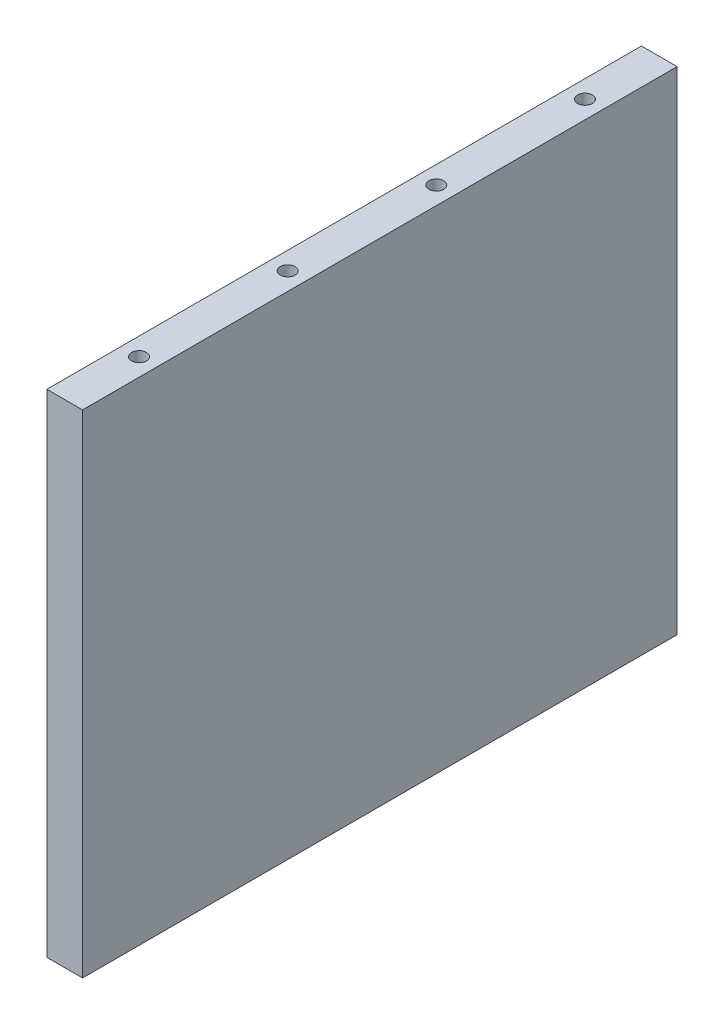
ISO-10303-21;
HEADER;
FILE_DESCRIPTION(('STEP AP214'),'2;1');
FILE_NAME('part.step','',(''),(''),'','','');
FILE_SCHEMA(('AUTOMOTIVE_DESIGN { 1 0 10303 214 1 1 1 1 }'));
ENDSEC;
DATA;
#1=APPLICATION_CONTEXT('core data for automotive mechanical design processes');
#2=APPLICATION_PROTOCOL_DEFINITION('international standard','automotive_design',2000,#1);
#3=PRODUCT_CONTEXT('',#1,'mechanical');
#4=PRODUCT('Part','Part','',(#3));
#5=PRODUCT_RELATED_PRODUCT_CATEGORY('part','',(#4));
#6=PRODUCT_DEFINITION_FORMATION('','',#4);
#7=PRODUCT_DEFINITION_CONTEXT('part definition',#1,'design');
#8=PRODUCT_DEFINITION('design','',#6,#7);
#9=PRODUCT_DEFINITION_SHAPE('','',#8);
#10=(LENGTH_UNIT() NAMED_UNIT(*) SI_UNIT(.MILLI.,.METRE.));
#11=(NAMED_UNIT(*) PLANE_ANGLE_UNIT() SI_UNIT($,.RADIAN.));
#12=(NAMED_UNIT(*) SI_UNIT($,.STERADIAN.) SOLID_ANGLE_UNIT());
#13=UNCERTAINTY_MEASURE_WITH_UNIT(LENGTH_MEASURE(1.E-05),#10,'distance_accuracy_value','');
#14=(GEOMETRIC_REPRESENTATION_CONTEXT(3) GLOBAL_UNCERTAINTY_ASSIGNED_CONTEXT((#13)) GLOBAL_UNIT_ASSIGNED_CONTEXT((#10,
#11,#12)) REPRESENTATION_CONTEXT('',''));
#15=CARTESIAN_POINT('',(0.,0.,0.));
#16=DIRECTION('',(0.,0.,1.));
#17=DIRECTION('',(1.,0.,0.));
#18=AXIS2_PLACEMENT_3D('',#15,#16,#17);
#19=CARTESIAN_POINT('',(0.,0.,0.));
#20=DIRECTION('',(0.,0.,-1.));
#21=DIRECTION('',(-1.,0.,0.));
#22=AXIS2_PLACEMENT_3D('',#19,#20,#21);
#23=PLANE('',#22);
#24=DIRECTION('',(0.,1.,0.));
#25=VECTOR('',#24,1.);
#26=CARTESIAN_POINT('',(-119.,165.,0.));
#27=LINE('',#26,#25);
#28=CARTESIAN_POINT('',(-119.,42.5000000000002,0.));
#29=VERTEX_POINT('',#28);
#30=CARTESIAN_POINT('',(-119.,208.,0.));
#31=VERTEX_POINT('',#30);
#32=EDGE_CURVE('E81',#29,#31,#27,.T.);
#33=ORIENTED_EDGE('',*,*,#32,.F.);
#34=DIRECTION('',(1.,0.,0.));
#35=VECTOR('',#34,1.);
#36=CARTESIAN_POINT('',(-119.,42.5000000000002,0.));
#37=LINE('',#36,#35);
#38=CARTESIAN_POINT('',(-131.,42.5000000000002,0.));
#39=VERTEX_POINT('',#38);
#40=EDGE_CURVE('E92',#39,#29,#37,.T.);
#41=ORIENTED_EDGE('',*,*,#40,.F.);
#42=DIRECTION('',(0.,-1.,0.));
#43=VECTOR('',#42,1.);
#44=CARTESIAN_POINT('',(-131.,42.5000000000002,0.));
#45=LINE('',#44,#43);
#46=CARTESIAN_POINT('',(-131.,208.,0.));
#47=VERTEX_POINT('',#46);
#48=EDGE_CURVE('E90',#47,#39,#45,.T.);
#49=ORIENTED_EDGE('',*,*,#48,.F.);
#50=DIRECTION('',(-1.,0.,0.));
#51=VECTOR('',#50,1.);
#52=CARTESIAN_POINT('',(-119.,208.,0.));
#53=LINE('',#52,#51);
#54=EDGE_CURVE('E76',#31,#47,#53,.T.);
#55=ORIENTED_EDGE('',*,*,#54,.F.);
#56=EDGE_LOOP('',(#33,#41,#49,#55));
#57=FACE_BOUND('',#56,.T.);
#58=ADVANCED_FACE('F33',(#57),#23,.T.);
#59=CARTESIAN_POINT('',(-119.,42.5000000000002,365.934475019509));
#60=DIRECTION('',(0.,1.,0.));
#61=DIRECTION('',(0.,0.,1.));
#62=AXIS2_PLACEMENT_3D('',#59,#60,#61);
#63=PLANE('',#62);
#64=CARTESIAN_POINT('',(-124.999999999998,42.5000000000002,175.));
#65=DIRECTION('',(0.,-1.,0.));
#66=DIRECTION('',(0.,0.,-1.));
#67=AXIS2_PLACEMENT_3D('',#64,#65,#66);
#68=CIRCLE('',#67,2.50000000000001);
#69=CARTESIAN_POINT('',(-124.999999999998,42.5000000000002,172.5));
#70=VERTEX_POINT('',#69);
#71=EDGE_CURVE('E149',#70,#70,#68,.T.);
#72=ORIENTED_EDGE('',*,*,#71,.F.);
#73=EDGE_LOOP('',(#72));
#74=FACE_BOUND('',#73,.T.);
#75=CARTESIAN_POINT('',(-124.999999999999,42.5000000000002,125.));
#76=DIRECTION('',(0.,-1.,0.));
#77=DIRECTION('',(0.,0.,-1.));
#78=AXIS2_PLACEMENT_3D('',#75,#76,#77);
#79=CIRCLE('',#78,2.50000000000001);
#80=CARTESIAN_POINT('',(-124.999999999999,42.5000000000002,122.5));
#81=VERTEX_POINT('',#80);
#82=EDGE_CURVE('E143',#81,#81,#79,.T.);
#83=ORIENTED_EDGE('',*,*,#82,.F.);
#84=EDGE_LOOP('',(#83));
#85=FACE_BOUND('',#84,.T.);
#86=CARTESIAN_POINT('',(-124.999999999999,42.5000000000002,75.));
#87=DIRECTION('',(0.,-1.,0.));
#88=DIRECTION('',(0.,0.,-1.));
#89=AXIS2_PLACEMENT_3D('',#86,#87,#88);
#90=CIRCLE('',#89,2.5);
#91=CARTESIAN_POINT('',(-124.999999999999,42.5000000000002,72.5));
#92=VERTEX_POINT('',#91);
#93=EDGE_CURVE('E137',#92,#92,#90,.T.);
#94=ORIENTED_EDGE('',*,*,#93,.F.);
#95=EDGE_LOOP('',(#94));
#96=FACE_BOUND('',#95,.T.);
#97=CARTESIAN_POINT('',(-125.,42.5000000000002,25.));
#98=DIRECTION('',(0.,-1.,0.));
#99=DIRECTION('',(0.,0.,-1.));
#100=AXIS2_PLACEMENT_3D('',#97,#98,#99);
#101=CIRCLE('',#100,2.5);
#102=CARTESIAN_POINT('',(-125.,42.5000000000002,22.5));
#103=VERTEX_POINT('',#102);
#104=EDGE_CURVE('E131',#103,#103,#101,.T.);
#105=ORIENTED_EDGE('',*,*,#104,.F.);
#106=EDGE_LOOP('',(#105));
#107=FACE_BOUND('',#106,.T.);
#108=DIRECTION('',(0.,0.,-1.));
#109=VECTOR('',#108,1.);
#110=CARTESIAN_POINT('',(-119.,42.5000000000002,365.934475019509));
#111=LINE('',#110,#109);
#112=CARTESIAN_POINT('',(-119.,42.5000000000002,200.));
#113=VERTEX_POINT('',#112);
#114=EDGE_CURVE('E83',#113,#29,#111,.T.);
#115=ORIENTED_EDGE('',*,*,#114,.F.);
#116=DIRECTION('',(-1.,0.,0.));
#117=VECTOR('',#116,1.);
#118=CARTESIAN_POINT('',(-119.,42.5000000000002,200.));
#119=LINE('',#118,#117);
#120=CARTESIAN_POINT('',(-131.,42.5000000000002,200.));
#121=VERTEX_POINT('',#120);
#122=EDGE_CURVE('E37',#113,#121,#119,.T.);
#123=ORIENTED_EDGE('',*,*,#122,.T.);
#124=DIRECTION('',(0.,0.,-1.));
#125=VECTOR('',#124,1.);
#126=CARTESIAN_POINT('',(-131.,42.5000000000002,365.934475019509));
#127=LINE('',#126,#125);
#128=EDGE_CURVE('E97',#121,#39,#127,.T.);
#129=ORIENTED_EDGE('',*,*,#128,.T.);
#130=ORIENTED_EDGE('',*,*,#40,.T.);
#131=EDGE_LOOP('',(#115,#123,#129,#130));
#132=FACE_BOUND('',#131,.T.);
#133=ADVANCED_FACE('F164',(#74,#85,#96,#107,#132),#63,.F.);
#134=CARTESIAN_POINT('',(-131.,42.5000000000002,365.934475019509));
#135=DIRECTION('',(1.,0.,0.));
#136=DIRECTION('',(0.,0.,-1.));
#137=AXIS2_PLACEMENT_3D('',#134,#135,#136);
#138=PLANE('',#137);
#139=ORIENTED_EDGE('',*,*,#128,.F.);
#140=DIRECTION('',(0.,1.,0.));
#141=VECTOR('',#140,1.);
#142=CARTESIAN_POINT('',(-131.,42.5000000000002,200.));
#143=LINE('',#142,#141);
#144=CARTESIAN_POINT('',(-131.,208.,200.));
#145=VERTEX_POINT('',#144);
#146=EDGE_CURVE('E103',#121,#145,#143,.T.);
#147=ORIENTED_EDGE('',*,*,#146,.T.);
#148=DIRECTION('',(0.,0.,-1.));
#149=VECTOR('',#148,1.);
#150=CARTESIAN_POINT('',(-131.,208.,365.934475019509));
#151=LINE('',#150,#149);
#152=EDGE_CURVE('E79',#145,#47,#151,.T.);
#153=ORIENTED_EDGE('',*,*,#152,.T.);
#154=ORIENTED_EDGE('',*,*,#48,.T.);
#155=EDGE_LOOP('',(#139,#147,#153,#154));
#156=FACE_BOUND('',#155,.T.);
#157=ADVANCED_FACE('F102',(#156),#138,.F.);
#158=CARTESIAN_POINT('',(-119.,208.,365.934475019509));
#159=DIRECTION('',(0.,-1.,0.));
#160=DIRECTION('',(0.,0.,-1.));
#161=AXIS2_PLACEMENT_3D('',#158,#159,#160);
#162=PLANE('',#161);
#163=CARTESIAN_POINT('',(-125.,208.,25.));
#164=DIRECTION('',(0.,1.,0.));
#165=DIRECTION('',(0.,0.,1.));
#166=AXIS2_PLACEMENT_3D('',#163,#164,#165);
#167=CIRCLE('',#166,2.5);
#168=CARTESIAN_POINT('',(-125.,208.,27.5));
#169=VERTEX_POINT('',#168);
#170=EDGE_CURVE('E126',#169,#169,#167,.T.);
#171=ORIENTED_EDGE('',*,*,#170,.F.);
#172=EDGE_LOOP('',(#171));
#173=FACE_BOUND('',#172,.T.);
#174=CARTESIAN_POINT('',(-124.999999999999,208.,75.));
#175=DIRECTION('',(0.,1.,0.));
#176=DIRECTION('',(0.,0.,1.));
#177=AXIS2_PLACEMENT_3D('',#174,#175,#176);
#178=CIRCLE('',#177,2.5);
#179=CARTESIAN_POINT('',(-124.999999999999,208.,77.5));
#180=VERTEX_POINT('',#179);
#181=EDGE_CURVE('E120',#180,#180,#178,.T.);
#182=ORIENTED_EDGE('',*,*,#181,.F.);
#183=EDGE_LOOP('',(#182));
#184=FACE_BOUND('',#183,.T.);
#185=CARTESIAN_POINT('',(-124.999999999999,208.,125.));
#186=DIRECTION('',(0.,1.,0.));
#187=DIRECTION('',(0.,0.,1.));
#188=AXIS2_PLACEMENT_3D('',#185,#186,#187);
#189=CIRCLE('',#188,2.5);
#190=CARTESIAN_POINT('',(-124.999999999999,208.,127.5));
#191=VERTEX_POINT('',#190);
#192=EDGE_CURVE('E114',#191,#191,#189,.T.);
#193=ORIENTED_EDGE('',*,*,#192,.F.);
#194=EDGE_LOOP('',(#193));
#195=FACE_BOUND('',#194,.T.);
#196=CARTESIAN_POINT('',(-124.999999999998,208.,175.));
#197=DIRECTION('',(0.,1.,0.));
#198=DIRECTION('',(0.,0.,1.));
#199=AXIS2_PLACEMENT_3D('',#196,#197,#198);
#200=CIRCLE('',#199,2.5);
#201=CARTESIAN_POINT('',(-124.999999999998,208.,177.5));
#202=VERTEX_POINT('',#201);
#203=EDGE_CURVE('E107',#202,#202,#200,.T.);
#204=ORIENTED_EDGE('',*,*,#203,.F.);
#205=EDGE_LOOP('',(#204));
#206=FACE_BOUND('',#205,.T.);
#207=ORIENTED_EDGE('',*,*,#152,.F.);
#208=DIRECTION('',(1.,0.,0.));
#209=VECTOR('',#208,1.);
#210=CARTESIAN_POINT('',(-119.,208.,200.));
#211=LINE('',#210,#209);
#212=CARTESIAN_POINT('',(-119.,208.,200.));
#213=VERTEX_POINT('',#212);
#214=EDGE_CURVE('E42',#145,#213,#211,.T.);
#215=ORIENTED_EDGE('',*,*,#214,.T.);
#216=DIRECTION('',(0.,0.,-1.));
#217=VECTOR('',#216,1.);
#218=CARTESIAN_POINT('',(-119.,208.,365.934475019509));
#219=LINE('',#218,#217);
#220=EDGE_CURVE('E72',#213,#31,#219,.T.);
#221=ORIENTED_EDGE('',*,*,#220,.T.);
#222=ORIENTED_EDGE('',*,*,#54,.T.);
#223=EDGE_LOOP('',(#207,#215,#221,#222));
#224=FACE_BOUND('',#223,.T.);
#225=ADVANCED_FACE('F74',(#173,#184,#195,#206,#224),#162,.F.);
#226=CARTESIAN_POINT('',(-119.,165.,365.934475019509));
#227=DIRECTION('',(-1.,0.,0.));
#228=DIRECTION('',(0.,0.,1.));
#229=AXIS2_PLACEMENT_3D('',#226,#227,#228);
#230=PLANE('',#229);
#231=ORIENTED_EDGE('',*,*,#220,.F.);
#232=DIRECTION('',(0.,-1.,0.));
#233=VECTOR('',#232,1.);
#234=CARTESIAN_POINT('',(-119.,165.,200.));
#235=LINE('',#234,#233);
#236=EDGE_CURVE('E11',#213,#113,#235,.T.);
#237=ORIENTED_EDGE('',*,*,#236,.T.);
#238=ORIENTED_EDGE('',*,*,#114,.T.);
#239=ORIENTED_EDGE('',*,*,#32,.T.);
#240=EDGE_LOOP('',(#231,#237,#238,#239));
#241=FACE_BOUND('',#240,.T.);
#242=ADVANCED_FACE('F35',(#241),#230,.F.);
#243=CARTESIAN_POINT('',(3.05311331771918E-12,-5.00000000000056,200.));
#244=DIRECTION('',(0.,0.,-1.));
#245=DIRECTION('',(-1.,0.,0.));
#246=AXIS2_PLACEMENT_3D('',#243,#244,#245);
#247=PLANE('',#246);
#248=ORIENTED_EDGE('',*,*,#214,.F.);
#249=ORIENTED_EDGE('',*,*,#146,.F.);
#250=ORIENTED_EDGE('',*,*,#122,.F.);
#251=ORIENTED_EDGE('',*,*,#236,.F.);
#252=EDGE_LOOP('',(#248,#249,#250,#251));
#253=FACE_BOUND('',#252,.T.);
#254=ADVANCED_FACE('F197',(#253),#247,.F.);
#255=CARTESIAN_POINT('',(-124.999999999998,193.,175.));
#256=DIRECTION('',(0.,1.,0.));
#257=DIRECTION('',(0.,0.,1.));
#258=AXIS2_PLACEMENT_3D('',#255,#256,#257);
#259=CYLINDRICAL_SURFACE('',#258,2.5);
#260=CARTESIAN_POINT('',(-124.999999999998,193.,175.));
#261=DIRECTION('',(0.,1.,0.));
#262=DIRECTION('',(0.,0.,1.));
#263=AXIS2_PLACEMENT_3D('',#260,#261,#262);
#264=CIRCLE('',#263,2.5);
#265=CARTESIAN_POINT('',(-124.999999999998,193.,177.5));
#266=VERTEX_POINT('',#265);
#267=EDGE_CURVE('E110',#266,#266,#264,.T.);
#268=ORIENTED_EDGE('',*,*,#267,.F.);
#269=EDGE_LOOP('',(#268));
#270=FACE_BOUND('',#269,.T.);
#271=ORIENTED_EDGE('',*,*,#203,.T.);
#272=EDGE_LOOP('',(#271));
#273=FACE_BOUND('',#272,.T.);
#274=ADVANCED_FACE('F214',(#270,#273),#259,.F.);
#275=CARTESIAN_POINT('',(-124.999999999998,193.,175.));
#276=DIRECTION('',(0.,1.,0.));
#277=DIRECTION('',(0.,0.,1.));
#278=AXIS2_PLACEMENT_3D('',#275,#276,#277);
#279=PLANE('',#278);
#280=ORIENTED_EDGE('',*,*,#267,.T.);
#281=EDGE_LOOP('',(#280));
#282=FACE_BOUND('',#281,.T.);
#283=ADVANCED_FACE('F216',(#282),#279,.T.);
#284=CARTESIAN_POINT('',(-124.999999999999,193.,125.));
#285=DIRECTION('',(0.,1.,0.));
#286=DIRECTION('',(0.,0.,1.));
#287=AXIS2_PLACEMENT_3D('',#284,#285,#286);
#288=CYLINDRICAL_SURFACE('',#287,2.5);
#289=CARTESIAN_POINT('',(-124.999999999999,193.,125.));
#290=DIRECTION('',(0.,1.,0.));
#291=DIRECTION('',(0.,0.,1.));
#292=AXIS2_PLACEMENT_3D('',#289,#290,#291);
#293=CIRCLE('',#292,2.5);
#294=CARTESIAN_POINT('',(-124.999999999999,193.,127.5));
#295=VERTEX_POINT('',#294);
#296=EDGE_CURVE('E117',#295,#295,#293,.T.);
#297=ORIENTED_EDGE('',*,*,#296,.F.);
#298=EDGE_LOOP('',(#297));
#299=FACE_BOUND('',#298,.T.);
#300=ORIENTED_EDGE('',*,*,#192,.T.);
#301=EDGE_LOOP('',(#300));
#302=FACE_BOUND('',#301,.T.);
#303=ADVANCED_FACE('F222',(#299,#302),#288,.F.);
#304=CARTESIAN_POINT('',(-124.999999999999,193.,125.));
#305=DIRECTION('',(0.,1.,0.));
#306=DIRECTION('',(0.,0.,1.));
#307=AXIS2_PLACEMENT_3D('',#304,#305,#306);
#308=PLANE('',#307);
#309=ORIENTED_EDGE('',*,*,#296,.T.);
#310=EDGE_LOOP('',(#309));
#311=FACE_BOUND('',#310,.T.);
#312=ADVANCED_FACE('F229',(#311),#308,.T.);
#313=CARTESIAN_POINT('',(-124.999999999999,193.,75.));
#314=DIRECTION('',(0.,1.,0.));
#315=DIRECTION('',(0.,0.,1.));
#316=AXIS2_PLACEMENT_3D('',#313,#314,#315);
#317=CYLINDRICAL_SURFACE('',#316,2.5);
#318=CARTESIAN_POINT('',(-124.999999999999,193.,75.));
#319=DIRECTION('',(0.,1.,0.));
#320=DIRECTION('',(0.,0.,1.));
#321=AXIS2_PLACEMENT_3D('',#318,#319,#320);
#322=CIRCLE('',#321,2.5);
#323=CARTESIAN_POINT('',(-124.999999999999,193.,77.5));
#324=VERTEX_POINT('',#323);
#325=EDGE_CURVE('E123',#324,#324,#322,.T.);
#326=ORIENTED_EDGE('',*,*,#325,.F.);
#327=EDGE_LOOP('',(#326));
#328=FACE_BOUND('',#327,.T.);
#329=ORIENTED_EDGE('',*,*,#181,.T.);
#330=EDGE_LOOP('',(#329));
#331=FACE_BOUND('',#330,.T.);
#332=ADVANCED_FACE('F233',(#328,#331),#317,.F.);
#333=CARTESIAN_POINT('',(-124.999999999999,193.,75.));
#334=DIRECTION('',(0.,1.,0.));
#335=DIRECTION('',(0.,0.,1.));
#336=AXIS2_PLACEMENT_3D('',#333,#334,#335);
#337=PLANE('',#336);
#338=ORIENTED_EDGE('',*,*,#325,.T.);
#339=EDGE_LOOP('',(#338));
#340=FACE_BOUND('',#339,.T.);
#341=ADVANCED_FACE('F237',(#340),#337,.T.);
#342=CARTESIAN_POINT('',(-125.,193.,25.));
#343=DIRECTION('',(0.,1.,0.));
#344=DIRECTION('',(0.,0.,1.));
#345=AXIS2_PLACEMENT_3D('',#342,#343,#344);
#346=CYLINDRICAL_SURFACE('',#345,2.5);
#347=CARTESIAN_POINT('',(-125.,193.,25.));
#348=DIRECTION('',(0.,1.,0.));
#349=DIRECTION('',(0.,0.,1.));
#350=AXIS2_PLACEMENT_3D('',#347,#348,#349);
#351=CIRCLE('',#350,2.5);
#352=CARTESIAN_POINT('',(-125.,193.,27.5));
#353=VERTEX_POINT('',#352);
#354=EDGE_CURVE('E87',#353,#353,#351,.T.);
#355=ORIENTED_EDGE('',*,*,#354,.F.);
#356=EDGE_LOOP('',(#355));
#357=FACE_BOUND('',#356,.T.);
#358=ORIENTED_EDGE('',*,*,#170,.T.);
#359=EDGE_LOOP('',(#358));
#360=FACE_BOUND('',#359,.T.);
#361=ADVANCED_FACE('F188',(#357,#360),#346,.F.);
#362=CARTESIAN_POINT('',(-125.,193.,25.));
#363=DIRECTION('',(0.,1.,0.));
#364=DIRECTION('',(0.,0.,1.));
#365=AXIS2_PLACEMENT_3D('',#362,#363,#364);
#366=PLANE('',#365);
#367=ORIENTED_EDGE('',*,*,#354,.T.);
#368=EDGE_LOOP('',(#367));
#369=FACE_BOUND('',#368,.T.);
#370=ADVANCED_FACE('F178',(#369),#366,.T.);
#371=CARTESIAN_POINT('',(-125.,57.5000000000002,25.));
#372=DIRECTION('',(0.,-1.,0.));
#373=DIRECTION('',(0.,0.,-1.));
#374=AXIS2_PLACEMENT_3D('',#371,#372,#373);
#375=CYLINDRICAL_SURFACE('',#374,2.5);
#376=CARTESIAN_POINT('',(-125.,57.5000000000002,25.));
#377=DIRECTION('',(0.,-1.,0.));
#378=DIRECTION('',(0.,0.,-1.));
#379=AXIS2_PLACEMENT_3D('',#376,#377,#378);
#380=CIRCLE('',#379,2.5);
#381=CARTESIAN_POINT('',(-125.,57.5000000000002,22.5));
#382=VERTEX_POINT('',#381);
#383=EDGE_CURVE('E134',#382,#382,#380,.T.);
#384=ORIENTED_EDGE('',*,*,#383,.F.);
#385=EDGE_LOOP('',(#384));
#386=FACE_BOUND('',#385,.T.);
#387=ORIENTED_EDGE('',*,*,#104,.T.);
#388=EDGE_LOOP('',(#387));
#389=FACE_BOUND('',#388,.T.);
#390=ADVANCED_FACE('F175',(#386,#389),#375,.F.);
#391=CARTESIAN_POINT('',(-125.,57.5000000000002,25.));
#392=DIRECTION('',(0.,-1.,0.));
#393=DIRECTION('',(0.,0.,-1.));
#394=AXIS2_PLACEMENT_3D('',#391,#392,#393);
#395=PLANE('',#394);
#396=ORIENTED_EDGE('',*,*,#383,.T.);
#397=EDGE_LOOP('',(#396));
#398=FACE_BOUND('',#397,.T.);
#399=ADVANCED_FACE('F177',(#398),#395,.T.);
#400=CARTESIAN_POINT('',(-124.999999999999,57.5000000000002,75.));
#401=DIRECTION('',(0.,-1.,0.));
#402=DIRECTION('',(0.,0.,-1.));
#403=AXIS2_PLACEMENT_3D('',#400,#401,#402);
#404=CYLINDRICAL_SURFACE('',#403,2.5);
#405=CARTESIAN_POINT('',(-124.999999999999,57.5000000000002,75.));
#406=DIRECTION('',(0.,-1.,0.));
#407=DIRECTION('',(0.,0.,-1.));
#408=AXIS2_PLACEMENT_3D('',#405,#406,#407);
#409=CIRCLE('',#408,2.5);
#410=CARTESIAN_POINT('',(-124.999999999999,57.5000000000002,72.5));
#411=VERTEX_POINT('',#410);
#412=EDGE_CURVE('E140',#411,#411,#409,.T.);
#413=ORIENTED_EDGE('',*,*,#412,.F.);
#414=EDGE_LOOP('',(#413));
#415=FACE_BOUND('',#414,.T.);
#416=ORIENTED_EDGE('',*,*,#93,.T.);
#417=EDGE_LOOP('',(#416));
#418=FACE_BOUND('',#417,.T.);
#419=ADVANCED_FACE('F185',(#415,#418),#404,.F.);
#420=CARTESIAN_POINT('',(-124.999999999999,57.5000000000002,75.));
#421=DIRECTION('',(0.,-1.,0.));
#422=DIRECTION('',(0.,0.,-1.));
#423=AXIS2_PLACEMENT_3D('',#420,#421,#422);
#424=PLANE('',#423);
#425=ORIENTED_EDGE('',*,*,#412,.T.);
#426=EDGE_LOOP('',(#425));
#427=FACE_BOUND('',#426,.T.);
#428=ADVANCED_FACE('F281',(#427),#424,.T.);
#429=CARTESIAN_POINT('',(-124.999999999999,57.5000000000002,125.));
#430=DIRECTION('',(0.,-1.,0.));
#431=DIRECTION('',(0.,0.,-1.));
#432=AXIS2_PLACEMENT_3D('',#429,#430,#431);
#433=CYLINDRICAL_SURFACE('',#432,2.50000000000001);
#434=CARTESIAN_POINT('',(-124.999999999999,57.5000000000002,125.));
#435=DIRECTION('',(0.,-1.,0.));
#436=DIRECTION('',(0.,0.,-1.));
#437=AXIS2_PLACEMENT_3D('',#434,#435,#436);
#438=CIRCLE('',#437,2.50000000000001);
#439=CARTESIAN_POINT('',(-124.999999999999,57.5000000000002,122.5));
#440=VERTEX_POINT('',#439);
#441=EDGE_CURVE('E146',#440,#440,#438,.T.);
#442=ORIENTED_EDGE('',*,*,#441,.F.);
#443=EDGE_LOOP('',(#442));
#444=FACE_BOUND('',#443,.T.);
#445=ORIENTED_EDGE('',*,*,#82,.T.);
#446=EDGE_LOOP('',(#445));
#447=FACE_BOUND('',#446,.T.);
#448=ADVANCED_FACE('F291',(#444,#447),#433,.F.);
#449=CARTESIAN_POINT('',(-124.999999999999,57.5000000000002,125.));
#450=DIRECTION('',(0.,-1.,0.));
#451=DIRECTION('',(0.,0.,-1.));
#452=AXIS2_PLACEMENT_3D('',#449,#450,#451);
#453=PLANE('',#452);
#454=ORIENTED_EDGE('',*,*,#441,.T.);
#455=EDGE_LOOP('',(#454));
#456=FACE_BOUND('',#455,.T.);
#457=ADVANCED_FACE('F160',(#456),#453,.T.);
#458=CARTESIAN_POINT('',(-124.999999999998,57.5000000000002,175.));
#459=DIRECTION('',(0.,-1.,0.));
#460=DIRECTION('',(0.,0.,-1.));
#461=AXIS2_PLACEMENT_3D('',#458,#459,#460);
#462=CYLINDRICAL_SURFACE('',#461,2.50000000000001);
#463=CARTESIAN_POINT('',(-124.999999999998,57.5000000000002,175.));
#464=DIRECTION('',(0.,-1.,0.));
#465=DIRECTION('',(0.,0.,-1.));
#466=AXIS2_PLACEMENT_3D('',#463,#464,#465);
#467=CIRCLE('',#466,2.50000000000001);
#468=CARTESIAN_POINT('',(-124.999999999998,57.5000000000002,172.5));
#469=VERTEX_POINT('',#468);
#470=EDGE_CURVE('E111',#469,#469,#467,.T.);
#471=ORIENTED_EDGE('',*,*,#470,.F.);
#472=EDGE_LOOP('',(#471));
#473=FACE_BOUND('',#472,.T.);
#474=ORIENTED_EDGE('',*,*,#71,.T.);
#475=EDGE_LOOP('',(#474));
#476=FACE_BOUND('',#475,.T.);
#477=ADVANCED_FACE('F157',(#473,#476),#462,.F.);
#478=CARTESIAN_POINT('',(-124.999999999998,57.5000000000002,175.));
#479=DIRECTION('',(0.,-1.,0.));
#480=DIRECTION('',(0.,0.,-1.));
#481=AXIS2_PLACEMENT_3D('',#478,#479,#480);
#482=PLANE('',#481);
#483=ORIENTED_EDGE('',*,*,#470,.T.);
#484=EDGE_LOOP('',(#483));
#485=FACE_BOUND('',#484,.T.);
#486=ADVANCED_FACE('F155',(#485),#482,.T.);
#487=CLOSED_SHELL('',(#58,#133,#157,#225,#242,#254,#274,#283,#303,#312,#332,#341,#361,#370,#390,
#399,#419,#428,#448,#457,#477,#486));
#488=MANIFOLD_SOLID_BREP('B2',#487);
#489=ADVANCED_BREP_SHAPE_REPRESENTATION('',(#18,#488),#14);
#490=SHAPE_DEFINITION_REPRESENTATION(#9,#489);
ENDSEC;
END-ISO-10303-21;
